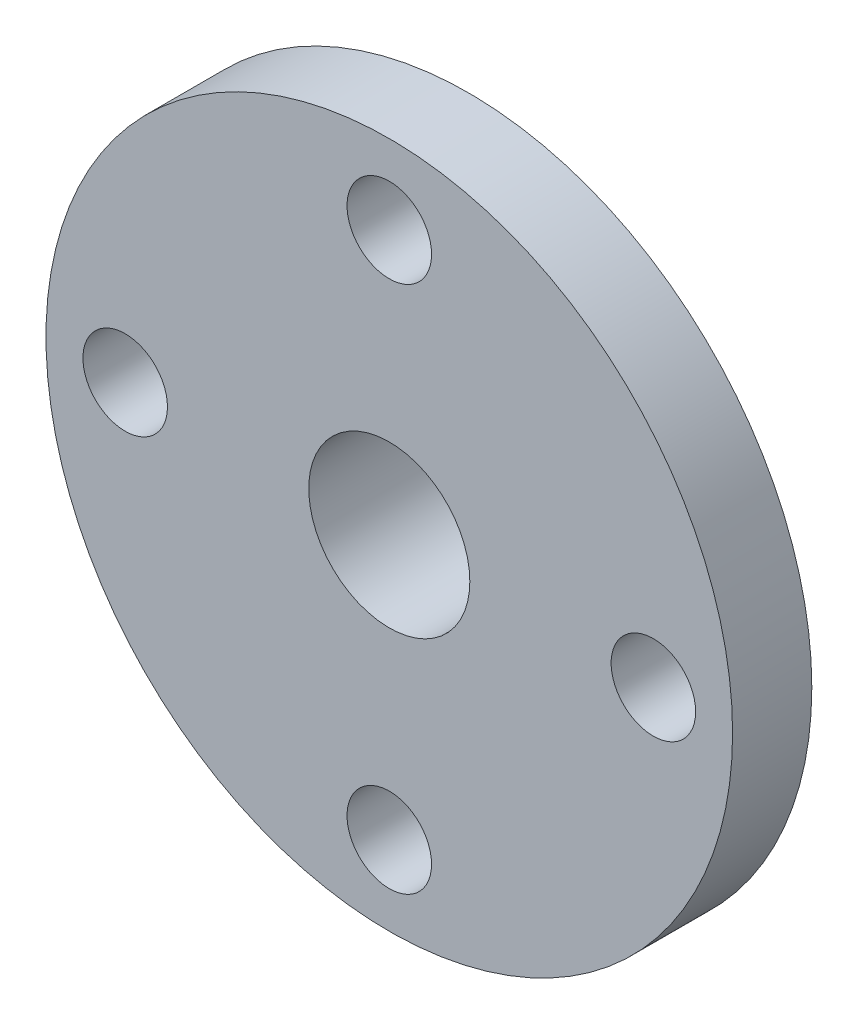
ISO-10303-21;
HEADER;
FILE_DESCRIPTION(('STEP AP214'),'2;1');
FILE_NAME('part.step','',(''),(''),'','','');
FILE_SCHEMA(('AUTOMOTIVE_DESIGN { 1 0 10303 214 1 1 1 1 }'));
ENDSEC;
DATA;
#1=APPLICATION_CONTEXT('core data for automotive mechanical design processes');
#2=APPLICATION_PROTOCOL_DEFINITION('international standard','automotive_design',2000,#1);
#3=PRODUCT_CONTEXT('',#1,'mechanical');
#4=PRODUCT('Part','Part','',(#3));
#5=PRODUCT_RELATED_PRODUCT_CATEGORY('part','',(#4));
#6=PRODUCT_DEFINITION_FORMATION('','',#4);
#7=PRODUCT_DEFINITION_CONTEXT('part definition',#1,'design');
#8=PRODUCT_DEFINITION('design','',#6,#7);
#9=PRODUCT_DEFINITION_SHAPE('','',#8);
#10=(LENGTH_UNIT() NAMED_UNIT(*) SI_UNIT(.MILLI.,.METRE.));
#11=(NAMED_UNIT(*) PLANE_ANGLE_UNIT() SI_UNIT($,.RADIAN.));
#12=(NAMED_UNIT(*) SI_UNIT($,.STERADIAN.) SOLID_ANGLE_UNIT());
#13=UNCERTAINTY_MEASURE_WITH_UNIT(LENGTH_MEASURE(1.E-05),#10,'distance_accuracy_value','');
#14=(GEOMETRIC_REPRESENTATION_CONTEXT(3) GLOBAL_UNCERTAINTY_ASSIGNED_CONTEXT((#13)) GLOBAL_UNIT_ASSIGNED_CONTEXT((#10,
#11,#12)) REPRESENTATION_CONTEXT('',''));
#15=CARTESIAN_POINT('',(0.,0.,0.));
#16=DIRECTION('',(0.,0.,1.));
#17=DIRECTION('',(1.,0.,0.));
#18=AXIS2_PLACEMENT_3D('',#15,#16,#17);
#19=CARTESIAN_POINT('',(0.,0.,3.));
#20=DIRECTION('',(0.,0.,1.));
#21=DIRECTION('',(1.,0.,0.));
#22=AXIS2_PLACEMENT_3D('',#19,#20,#21);
#23=PLANE('',#22);
#24=CARTESIAN_POINT('',(-10.,0.,3.));
#25=DIRECTION('',(0.,0.,1.));
#26=DIRECTION('',(1.,0.,0.));
#27=AXIS2_PLACEMENT_3D('',#24,#25,#26);
#28=CIRCLE('',#27,1.6);
#29=CARTESIAN_POINT('',(-8.4,0.,3.));
#30=VERTEX_POINT('',#29);
#31=EDGE_CURVE('E70',#30,#30,#28,.T.);
#32=ORIENTED_EDGE('',*,*,#31,.F.);
#33=EDGE_LOOP('',(#32));
#34=FACE_BOUND('',#33,.T.);
#35=CARTESIAN_POINT('',(10.,0.,3.));
#36=DIRECTION('',(0.,0.,1.));
#37=DIRECTION('',(1.,0.,0.));
#38=AXIS2_PLACEMENT_3D('',#35,#36,#37);
#39=CIRCLE('',#38,1.6);
#40=CARTESIAN_POINT('',(11.6,0.,3.));
#41=VERTEX_POINT('',#40);
#42=EDGE_CURVE('E144',#41,#41,#39,.T.);
#43=ORIENTED_EDGE('',*,*,#42,.F.);
#44=EDGE_LOOP('',(#43));
#45=FACE_BOUND('',#44,.T.);
#46=CARTESIAN_POINT('',(0.,-10.,3.));
#47=DIRECTION('',(0.,0.,1.));
#48=DIRECTION('',(1.,0.,0.));
#49=AXIS2_PLACEMENT_3D('',#46,#47,#48);
#50=CIRCLE('',#49,1.6);
#51=CARTESIAN_POINT('',(1.6,-10.,3.));
#52=VERTEX_POINT('',#51);
#53=EDGE_CURVE('E149',#52,#52,#50,.T.);
#54=ORIENTED_EDGE('',*,*,#53,.F.);
#55=EDGE_LOOP('',(#54));
#56=FACE_BOUND('',#55,.T.);
#57=CARTESIAN_POINT('',(0.,10.,3.));
#58=DIRECTION('',(0.,0.,1.));
#59=DIRECTION('',(1.,0.,0.));
#60=AXIS2_PLACEMENT_3D('',#57,#58,#59);
#61=CIRCLE('',#60,1.6);
#62=CARTESIAN_POINT('',(1.6,10.,3.));
#63=VERTEX_POINT('',#62);
#64=EDGE_CURVE('E95',#63,#63,#61,.T.);
#65=ORIENTED_EDGE('',*,*,#64,.F.);
#66=EDGE_LOOP('',(#65));
#67=FACE_BOUND('',#66,.T.);
#68=CARTESIAN_POINT('',(0.,0.,3.));
#69=DIRECTION('',(0.,0.,1.));
#70=DIRECTION('',(1.,0.,0.));
#71=AXIS2_PLACEMENT_3D('',#68,#69,#70);
#72=CIRCLE('',#71,13.);
#73=CARTESIAN_POINT('',(13.,0.,3.));
#74=VERTEX_POINT('',#73);
#75=EDGE_CURVE('E10',#74,#74,#72,.T.);
#76=ORIENTED_EDGE('',*,*,#75,.T.);
#77=EDGE_LOOP('',(#76));
#78=FACE_BOUND('',#77,.T.);
#79=CARTESIAN_POINT('',(0.,0.,3.));
#80=DIRECTION('',(0.,0.,1.));
#81=DIRECTION('',(1.,0.,0.));
#82=AXIS2_PLACEMENT_3D('',#79,#80,#81);
#83=CIRCLE('',#82,3.05);
#84=CARTESIAN_POINT('',(3.05,0.,3.));
#85=VERTEX_POINT('',#84);
#86=EDGE_CURVE('E59',#85,#85,#83,.T.);
#87=ORIENTED_EDGE('',*,*,#86,.F.);
#88=EDGE_LOOP('',(#87));
#89=FACE_BOUND('',#88,.T.);
#90=ADVANCED_FACE('F43',(#34,#45,#56,#67,#78,#89),#23,.T.);
#91=CARTESIAN_POINT('',(0.,0.,0.));
#92=DIRECTION('',(0.,0.,1.));
#93=DIRECTION('',(1.,0.,0.));
#94=AXIS2_PLACEMENT_3D('',#91,#92,#93);
#95=PLANE('',#94);
#96=CARTESIAN_POINT('',(-10.,0.,0.));
#97=DIRECTION('',(0.,0.,1.));
#98=DIRECTION('',(1.,0.,0.));
#99=AXIS2_PLACEMENT_3D('',#96,#97,#98);
#100=CIRCLE('',#99,1.6);
#101=CARTESIAN_POINT('',(-8.4,0.,0.));
#102=VERTEX_POINT('',#101);
#103=EDGE_CURVE('E50',#102,#102,#100,.F.);
#104=ORIENTED_EDGE('',*,*,#103,.F.);
#105=EDGE_LOOP('',(#104));
#106=FACE_BOUND('',#105,.T.);
#107=CARTESIAN_POINT('',(10.,0.,0.));
#108=DIRECTION('',(0.,0.,1.));
#109=DIRECTION('',(1.,0.,0.));
#110=AXIS2_PLACEMENT_3D('',#107,#108,#109);
#111=CIRCLE('',#110,1.6);
#112=CARTESIAN_POINT('',(11.6,0.,0.));
#113=VERTEX_POINT('',#112);
#114=EDGE_CURVE('E72',#113,#113,#111,.F.);
#115=ORIENTED_EDGE('',*,*,#114,.F.);
#116=EDGE_LOOP('',(#115));
#117=FACE_BOUND('',#116,.T.);
#118=CARTESIAN_POINT('',(0.,-10.,0.));
#119=DIRECTION('',(0.,0.,1.));
#120=DIRECTION('',(1.,0.,0.));
#121=AXIS2_PLACEMENT_3D('',#118,#119,#120);
#122=CIRCLE('',#121,1.6);
#123=CARTESIAN_POINT('',(1.6,-10.,0.));
#124=VERTEX_POINT('',#123);
#125=EDGE_CURVE('E66',#124,#124,#122,.F.);
#126=ORIENTED_EDGE('',*,*,#125,.F.);
#127=EDGE_LOOP('',(#126));
#128=FACE_BOUND('',#127,.T.);
#129=CARTESIAN_POINT('',(0.,10.,0.));
#130=DIRECTION('',(0.,0.,1.));
#131=DIRECTION('',(1.,0.,0.));
#132=AXIS2_PLACEMENT_3D('',#129,#130,#131);
#133=CIRCLE('',#132,1.6);
#134=CARTESIAN_POINT('',(1.6,10.,0.));
#135=VERTEX_POINT('',#134);
#136=EDGE_CURVE('E64',#135,#135,#133,.F.);
#137=ORIENTED_EDGE('',*,*,#136,.F.);
#138=EDGE_LOOP('',(#137));
#139=FACE_BOUND('',#138,.T.);
#140=CARTESIAN_POINT('',(0.,0.,0.));
#141=DIRECTION('',(0.,0.,1.));
#142=DIRECTION('',(1.,0.,0.));
#143=AXIS2_PLACEMENT_3D('',#140,#141,#142);
#144=CIRCLE('',#143,4.5);
#145=CARTESIAN_POINT('',(4.5,0.,0.));
#146=VERTEX_POINT('',#145);
#147=EDGE_CURVE('E90',#146,#146,#144,.T.);
#148=ORIENTED_EDGE('',*,*,#147,.T.);
#149=EDGE_LOOP('',(#148));
#150=FACE_BOUND('',#149,.T.);
#151=CARTESIAN_POINT('',(0.,0.,0.));
#152=DIRECTION('',(0.,0.,1.));
#153=DIRECTION('',(1.,0.,0.));
#154=AXIS2_PLACEMENT_3D('',#151,#152,#153);
#155=CIRCLE('',#154,13.);
#156=CARTESIAN_POINT('',(13.,0.,0.));
#157=VERTEX_POINT('',#156);
#158=EDGE_CURVE('E55',#157,#157,#155,.T.);
#159=ORIENTED_EDGE('',*,*,#158,.F.);
#160=EDGE_LOOP('',(#159));
#161=FACE_BOUND('',#160,.T.);
#162=ADVANCED_FACE('F106',(#106,#117,#128,#139,#150,#161),#95,.F.);
#163=CARTESIAN_POINT('',(0.,0.,3.));
#164=DIRECTION('',(0.,0.,-1.));
#165=DIRECTION('',(-1.,0.,0.));
#166=AXIS2_PLACEMENT_3D('',#163,#164,#165);
#167=CYLINDRICAL_SURFACE('',#166,13.);
#168=ORIENTED_EDGE('',*,*,#75,.F.);
#169=EDGE_LOOP('',(#168));
#170=FACE_BOUND('',#169,.T.);
#171=ORIENTED_EDGE('',*,*,#158,.T.);
#172=EDGE_LOOP('',(#171));
#173=FACE_BOUND('',#172,.T.);
#174=ADVANCED_FACE('F44',(#170,#173),#167,.T.);
#175=CARTESIAN_POINT('',(0.,0.,3.));
#176=DIRECTION('',(0.,0.,-1.));
#177=DIRECTION('',(-1.,0.,0.));
#178=AXIS2_PLACEMENT_3D('',#175,#176,#177);
#179=CYLINDRICAL_SURFACE('',#178,3.05);
#180=ORIENTED_EDGE('',*,*,#86,.T.);
#181=EDGE_LOOP('',(#180));
#182=FACE_BOUND('',#181,.T.);
#183=CARTESIAN_POINT('',(0.,0.,-4.));
#184=DIRECTION('',(0.,0.,1.));
#185=DIRECTION('',(1.,0.,0.));
#186=AXIS2_PLACEMENT_3D('',#183,#184,#185);
#187=CIRCLE('',#186,3.05);
#188=CARTESIAN_POINT('',(3.05,0.,-4.));
#189=VERTEX_POINT('',#188);
#190=EDGE_CURVE('E79',#189,#189,#187,.T.);
#191=ORIENTED_EDGE('',*,*,#190,.F.);
#192=EDGE_LOOP('',(#191));
#193=FACE_BOUND('',#192,.T.);
#194=ADVANCED_FACE('F105',(#182,#193),#179,.F.);
#195=CARTESIAN_POINT('',(0.,0.,-4.));
#196=DIRECTION('',(0.,0.,1.));
#197=DIRECTION('',(1.,0.,0.));
#198=AXIS2_PLACEMENT_3D('',#195,#196,#197);
#199=PLANE('',#198);
#200=CARTESIAN_POINT('',(0.,0.,-4.));
#201=DIRECTION('',(0.,0.,1.));
#202=DIRECTION('',(1.,0.,0.));
#203=AXIS2_PLACEMENT_3D('',#200,#201,#202);
#204=CIRCLE('',#203,4.5);
#205=CARTESIAN_POINT('',(4.5,0.,-4.));
#206=VERTEX_POINT('',#205);
#207=EDGE_CURVE('E85',#206,#206,#204,.T.);
#208=ORIENTED_EDGE('',*,*,#207,.F.);
#209=EDGE_LOOP('',(#208));
#210=FACE_BOUND('',#209,.T.);
#211=ORIENTED_EDGE('',*,*,#190,.T.);
#212=EDGE_LOOP('',(#211));
#213=FACE_BOUND('',#212,.T.);
#214=ADVANCED_FACE('F116',(#210,#213),#199,.F.);
#215=CARTESIAN_POINT('',(0.,0.,0.));
#216=DIRECTION('',(0.,0.,-1.));
#217=DIRECTION('',(-1.,0.,0.));
#218=AXIS2_PLACEMENT_3D('',#215,#216,#217);
#219=CYLINDRICAL_SURFACE('',#218,4.5);
#220=ORIENTED_EDGE('',*,*,#147,.F.);
#221=EDGE_LOOP('',(#220));
#222=FACE_BOUND('',#221,.T.);
#223=ORIENTED_EDGE('',*,*,#207,.T.);
#224=EDGE_LOOP('',(#223));
#225=FACE_BOUND('',#224,.T.);
#226=ADVANCED_FACE('F118',(#222,#225),#219,.T.);
#227=CARTESIAN_POINT('',(0.,10.,3.));
#228=DIRECTION('',(0.,0.,-1.));
#229=DIRECTION('',(-1.,0.,0.));
#230=AXIS2_PLACEMENT_3D('',#227,#228,#229);
#231=CYLINDRICAL_SURFACE('',#230,1.6);
#232=ORIENTED_EDGE('',*,*,#64,.T.);
#233=EDGE_LOOP('',(#232));
#234=FACE_BOUND('',#233,.T.);
#235=ORIENTED_EDGE('',*,*,#136,.T.);
#236=EDGE_LOOP('',(#235));
#237=FACE_BOUND('',#236,.T.);
#238=ADVANCED_FACE('F121',(#234,#237),#231,.F.);
#239=CARTESIAN_POINT('',(0.,-10.,3.));
#240=DIRECTION('',(0.,0.,-1.));
#241=DIRECTION('',(-1.,0.,0.));
#242=AXIS2_PLACEMENT_3D('',#239,#240,#241);
#243=CYLINDRICAL_SURFACE('',#242,1.6);
#244=ORIENTED_EDGE('',*,*,#53,.T.);
#245=EDGE_LOOP('',(#244));
#246=FACE_BOUND('',#245,.T.);
#247=ORIENTED_EDGE('',*,*,#125,.T.);
#248=EDGE_LOOP('',(#247));
#249=FACE_BOUND('',#248,.T.);
#250=ADVANCED_FACE('F129',(#246,#249),#243,.F.);
#251=CARTESIAN_POINT('',(10.,0.,3.));
#252=DIRECTION('',(0.,0.,-1.));
#253=DIRECTION('',(-1.,0.,0.));
#254=AXIS2_PLACEMENT_3D('',#251,#252,#253);
#255=CYLINDRICAL_SURFACE('',#254,1.6);
#256=ORIENTED_EDGE('',*,*,#42,.T.);
#257=EDGE_LOOP('',(#256));
#258=FACE_BOUND('',#257,.T.);
#259=ORIENTED_EDGE('',*,*,#114,.T.);
#260=EDGE_LOOP('',(#259));
#261=FACE_BOUND('',#260,.T.);
#262=ADVANCED_FACE('F134',(#258,#261),#255,.F.);
#263=CARTESIAN_POINT('',(-10.,0.,3.));
#264=DIRECTION('',(0.,0.,-1.));
#265=DIRECTION('',(-1.,0.,0.));
#266=AXIS2_PLACEMENT_3D('',#263,#264,#265);
#267=CYLINDRICAL_SURFACE('',#266,1.6);
#268=ORIENTED_EDGE('',*,*,#31,.T.);
#269=EDGE_LOOP('',(#268));
#270=FACE_BOUND('',#269,.T.);
#271=ORIENTED_EDGE('',*,*,#103,.T.);
#272=EDGE_LOOP('',(#271));
#273=FACE_BOUND('',#272,.T.);
#274=ADVANCED_FACE('F136',(#270,#273),#267,.F.);
#275=CLOSED_SHELL('',(#90,#162,#174,#194,#214,#226,#238,#250,#262,#274));
#276=MANIFOLD_SOLID_BREP('B2',#275);
#277=ADVANCED_BREP_SHAPE_REPRESENTATION('',(#18,#276),#14);
#278=SHAPE_DEFINITION_REPRESENTATION(#9,#277);
ENDSEC;
END-ISO-10303-21;
